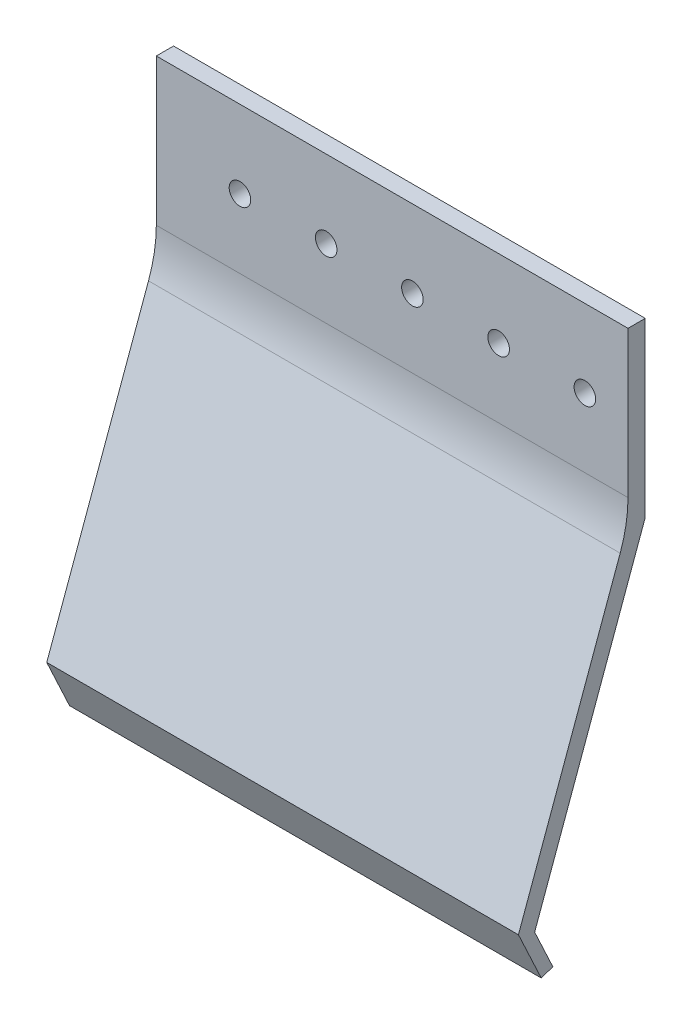
ISO-10303-21;
HEADER;
FILE_DESCRIPTION(('STEP AP214'),'2;1');
FILE_NAME('part.step','',(''),(''),'','','');
FILE_SCHEMA(('AUTOMOTIVE_DESIGN { 1 0 10303 214 1 1 1 1 }'));
ENDSEC;
DATA;
#1=APPLICATION_CONTEXT('core data for automotive mechanical design processes');
#2=APPLICATION_PROTOCOL_DEFINITION('international standard','automotive_design',2000,#1);
#3=PRODUCT_CONTEXT('',#1,'mechanical');
#4=PRODUCT('Part','Part','',(#3));
#5=PRODUCT_RELATED_PRODUCT_CATEGORY('part','',(#4));
#6=PRODUCT_DEFINITION_FORMATION('','',#4);
#7=PRODUCT_DEFINITION_CONTEXT('part definition',#1,'design');
#8=PRODUCT_DEFINITION('design','',#6,#7);
#9=PRODUCT_DEFINITION_SHAPE('','',#8);
#10=(LENGTH_UNIT() NAMED_UNIT(*) SI_UNIT(.MILLI.,.METRE.));
#11=(NAMED_UNIT(*) PLANE_ANGLE_UNIT() SI_UNIT($,.RADIAN.));
#12=(NAMED_UNIT(*) SI_UNIT($,.STERADIAN.) SOLID_ANGLE_UNIT());
#13=UNCERTAINTY_MEASURE_WITH_UNIT(LENGTH_MEASURE(1.E-05),#10,'distance_accuracy_value','');
#14=(GEOMETRIC_REPRESENTATION_CONTEXT(3) GLOBAL_UNCERTAINTY_ASSIGNED_CONTEXT((#13)) GLOBAL_UNIT_ASSIGNED_CONTEXT((#10,
#11,#12)) REPRESENTATION_CONTEXT('',''));
#15=CARTESIAN_POINT('',(0.,0.,0.));
#16=DIRECTION('',(0.,0.,1.));
#17=DIRECTION('',(1.,0.,0.));
#18=AXIS2_PLACEMENT_3D('',#15,#16,#17);
#19=CARTESIAN_POINT('',(-72.2,0.,8.));
#20=DIRECTION('',(1.,0.,0.));
#21=DIRECTION('',(0.,0.,-1.));
#22=AXIS2_PLACEMENT_3D('',#19,#20,#21);
#23=PLANE('',#22);
#24=DIRECTION('',(0.,0.,-1.));
#25=VECTOR('',#24,1.);
#26=CARTESIAN_POINT('',(-72.2,112.2,0.));
#27=LINE('',#26,#25);
#28=CARTESIAN_POINT('',(-72.2,112.2,12.));
#29=VERTEX_POINT('',#28);
#30=CARTESIAN_POINT('',(-72.2,112.2,8.));
#31=VERTEX_POINT('',#30);
#32=EDGE_CURVE('E11',#29,#31,#27,.T.);
#33=ORIENTED_EDGE('',*,*,#32,.T.);
#34=DIRECTION('',(0.,-1.,0.));
#35=VECTOR('',#34,1.);
#36=CARTESIAN_POINT('',(-72.2,0.,8.));
#37=LINE('',#36,#35);
#38=CARTESIAN_POINT('',(-72.2,72.2,8.));
#39=VERTEX_POINT('',#38);
#40=EDGE_CURVE('E113',#31,#39,#37,.T.);
#41=ORIENTED_EDGE('',*,*,#40,.T.);
#42=DIRECTION('',(0.,-0.939692620785906,0.342020143325676));
#43=VECTOR('',#42,1.);
#44=CARTESIAN_POINT('',(-72.2,72.2,8.));
#45=LINE('',#44,#43);
#46=CARTESIAN_POINT('',(-72.2,1.72305344105708,33.6515107494257));
#47=VERTEX_POINT('',#46);
#48=EDGE_CURVE('E191',#39,#47,#45,.T.);
#49=ORIENTED_EDGE('',*,*,#48,.T.);
#50=DIRECTION('',(0.,-0.906307787036651,-0.422618261740697));
#51=VECTOR('',#50,1.);
#52=CARTESIAN_POINT('',(-72.2,1.72305344105708,33.6515107494257));
#53=LINE('',#52,#51);
#54=CARTESIAN_POINT('',(-72.2,-7.34002442930944,29.4253281320187));
#55=VERTEX_POINT('',#54);
#56=EDGE_CURVE('E192',#47,#55,#53,.T.);
#57=ORIENTED_EDGE('',*,*,#56,.T.);
#58=DIRECTION('',(0.,-0.315262717408907,0.949004435717743));
#59=VECTOR('',#58,1.);
#60=CARTESIAN_POINT('',(-72.2,-8.23771332359837,32.1275529608106));
#61=LINE('',#60,#59);
#62=CARTESIAN_POINT('',(-72.2,-8.23771332359837,32.1275529608106));
#63=VERTEX_POINT('',#62);
#64=EDGE_CURVE('E195',#55,#63,#61,.T.);
#65=ORIENTED_EDGE('',*,*,#64,.T.);
#66=DIRECTION('',(0.,0.906307787036651,0.422618261740697));
#67=VECTOR('',#66,1.);
#68=CARTESIAN_POINT('',(-72.2,3.09113401435978,37.4102812325693));
#69=LINE('',#68,#67);
#70=CARTESIAN_POINT('',(-72.2,3.09113401435979,37.4102812325693));
#71=VERTEX_POINT('',#70);
#72=EDGE_CURVE('E220',#63,#71,#69,.T.);
#73=ORIENTED_EDGE('',*,*,#72,.T.);
#74=DIRECTION('',(0.,0.939692620785906,-0.342020143325676));
#75=VECTOR('',#74,1.);
#76=CARTESIAN_POINT('',(-72.2,72.9053079228339,12.));
#77=LINE('',#76,#75);
#78=CARTESIAN_POINT('',(-72.2,67.9345130443177,13.8092213764228));
#79=VERTEX_POINT('',#78);
#80=EDGE_CURVE('E175',#71,#79,#77,.T.);
#81=ORIENTED_EDGE('',*,*,#80,.T.);
#82=CARTESIAN_POINT('',(-72.2,78.195117344088,42.));
#83=DIRECTION('',(1.,0.,0.));
#84=DIRECTION('',(0.,0.,-1.));
#85=AXIS2_PLACEMENT_3D('',#82,#83,#84);
#86=CIRCLE('',#85,30.);
#87=CARTESIAN_POINT('',(-72.2,78.195117344088,12.));
#88=VERTEX_POINT('',#87);
#89=EDGE_CURVE('E128',#79,#88,#86,.T.);
#90=ORIENTED_EDGE('',*,*,#89,.T.);
#91=DIRECTION('',(0.,1.,0.));
#92=VECTOR('',#91,1.);
#93=CARTESIAN_POINT('',(-72.2,72.9053079228339,12.));
#94=LINE('',#93,#92);
#95=EDGE_CURVE('E170',#88,#29,#94,.T.);
#96=ORIENTED_EDGE('',*,*,#95,.T.);
#97=EDGE_LOOP('',(#33,#41,#49,#57,#65,#73,#81,#90,#96));
#98=FACE_BOUND('',#97,.T.);
#99=ADVANCED_FACE('F35',(#98),#23,.F.);
#100=CARTESIAN_POINT('',(37.2,0.,8.));
#101=DIRECTION('',(1.,0.,0.));
#102=DIRECTION('',(0.,0.,-1.));
#103=AXIS2_PLACEMENT_3D('',#100,#101,#102);
#104=PLANE('',#103);
#105=DIRECTION('',(0.,-1.,0.));
#106=VECTOR('',#105,1.);
#107=CARTESIAN_POINT('',(37.2,72.2,8.));
#108=LINE('',#107,#106);
#109=CARTESIAN_POINT('',(37.2,112.2,8.));
#110=VERTEX_POINT('',#109);
#111=CARTESIAN_POINT('',(37.2,72.2,8.));
#112=VERTEX_POINT('',#111);
#113=EDGE_CURVE('E110',#110,#112,#108,.T.);
#114=ORIENTED_EDGE('',*,*,#113,.F.);
#115=DIRECTION('',(0.,0.,1.));
#116=VECTOR('',#115,1.);
#117=CARTESIAN_POINT('',(37.2,112.2,0.));
#118=LINE('',#117,#116);
#119=CARTESIAN_POINT('',(37.2,112.2,12.));
#120=VERTEX_POINT('',#119);
#121=EDGE_CURVE('E43',#110,#120,#118,.T.);
#122=ORIENTED_EDGE('',*,*,#121,.T.);
#123=DIRECTION('',(0.,-1.,0.));
#124=VECTOR('',#123,1.);
#125=CARTESIAN_POINT('',(37.2,72.9053079228339,12.));
#126=LINE('',#125,#124);
#127=CARTESIAN_POINT('',(37.2,78.195117344088,12.));
#128=VERTEX_POINT('',#127);
#129=EDGE_CURVE('E179',#120,#128,#126,.T.);
#130=ORIENTED_EDGE('',*,*,#129,.T.);
#131=CARTESIAN_POINT('',(37.2,78.195117344088,42.));
#132=DIRECTION('',(-1.,0.,0.));
#133=DIRECTION('',(0.,0.,1.));
#134=AXIS2_PLACEMENT_3D('',#131,#132,#133);
#135=CIRCLE('',#134,30.);
#136=CARTESIAN_POINT('',(37.2,67.9345130443177,13.8092213764228));
#137=VERTEX_POINT('',#136);
#138=EDGE_CURVE('E51',#128,#137,#135,.T.);
#139=ORIENTED_EDGE('',*,*,#138,.T.);
#140=DIRECTION('',(0.,-0.939692620785906,0.342020143325676));
#141=VECTOR('',#140,1.);
#142=CARTESIAN_POINT('',(37.2,72.9053079228339,12.));
#143=LINE('',#142,#141);
#144=CARTESIAN_POINT('',(37.2,3.09113401435978,37.4102812325693));
#145=VERTEX_POINT('',#144);
#146=EDGE_CURVE('E200',#137,#145,#143,.T.);
#147=ORIENTED_EDGE('',*,*,#146,.T.);
#148=DIRECTION('',(0.,-0.906307787036651,-0.422618261740697));
#149=VECTOR('',#148,1.);
#150=CARTESIAN_POINT('',(37.2,3.09113401435978,37.4102812325693));
#151=LINE('',#150,#149);
#152=CARTESIAN_POINT('',(37.2,-8.23771332359837,32.1275529608106));
#153=VERTEX_POINT('',#152);
#154=EDGE_CURVE('E202',#145,#153,#151,.T.);
#155=ORIENTED_EDGE('',*,*,#154,.T.);
#156=DIRECTION('',(0.,0.315262717408907,-0.949004435717743));
#157=VECTOR('',#156,1.);
#158=CARTESIAN_POINT('',(37.2,-8.23771332359837,32.1275529608106));
#159=LINE('',#158,#157);
#160=CARTESIAN_POINT('',(37.2,-7.34002442930944,29.4253281320187));
#161=VERTEX_POINT('',#160);
#162=EDGE_CURVE('E205',#153,#161,#159,.T.);
#163=ORIENTED_EDGE('',*,*,#162,.T.);
#164=DIRECTION('',(0.,0.906307787036651,0.422618261740697));
#165=VECTOR('',#164,1.);
#166=CARTESIAN_POINT('',(37.2,1.72305344105708,33.6515107494257));
#167=LINE('',#166,#165);
#168=CARTESIAN_POINT('',(37.2,1.72305344105708,33.6515107494257));
#169=VERTEX_POINT('',#168);
#170=EDGE_CURVE('E185',#161,#169,#167,.T.);
#171=ORIENTED_EDGE('',*,*,#170,.T.);
#172=DIRECTION('',(0.,0.939692620785906,-0.342020143325676));
#173=VECTOR('',#172,1.);
#174=CARTESIAN_POINT('',(37.2,72.2,8.));
#175=LINE('',#174,#173);
#176=EDGE_CURVE('E122',#169,#112,#175,.T.);
#177=ORIENTED_EDGE('',*,*,#176,.T.);
#178=EDGE_LOOP('',(#114,#122,#130,#139,#147,#155,#163,#171,#177));
#179=FACE_BOUND('',#178,.T.);
#180=ADVANCED_FACE('F118',(#179),#104,.T.);
#181=CARTESIAN_POINT('',(-221.814036774629,112.2,0.));
#182=DIRECTION('',(0.,1.,0.));
#183=DIRECTION('',(0.,0.,1.));
#184=AXIS2_PLACEMENT_3D('',#181,#182,#183);
#185=PLANE('',#184);
#186=DIRECTION('',(1.,0.,0.));
#187=VECTOR('',#186,1.);
#188=CARTESIAN_POINT('',(-97.8,112.2,8.));
#189=LINE('',#188,#187);
#190=EDGE_CURVE('E107',#31,#110,#189,.T.);
#191=ORIENTED_EDGE('',*,*,#190,.F.);
#192=ORIENTED_EDGE('',*,*,#32,.F.);
#193=DIRECTION('',(1.,0.,0.));
#194=VECTOR('',#193,1.);
#195=CARTESIAN_POINT('',(-196.176640673943,112.2,12.));
#196=LINE('',#195,#194);
#197=EDGE_CURVE('E126',#29,#120,#196,.T.);
#198=ORIENTED_EDGE('',*,*,#197,.T.);
#199=ORIENTED_EDGE('',*,*,#121,.F.);
#200=EDGE_LOOP('',(#191,#192,#198,#199));
#201=FACE_BOUND('',#200,.T.);
#202=ADVANCED_FACE('F124',(#201),#185,.T.);
#203=CARTESIAN_POINT('',(-196.176640673943,72.2,8.));
#204=DIRECTION('',(0.,-0.342020143325676,-0.939692620785906));
#205=DIRECTION('',(0.,0.939692620785906,-0.342020143325676));
#206=AXIS2_PLACEMENT_3D('',#203,#204,#205);
#207=PLANE('',#206);
#208=ORIENTED_EDGE('',*,*,#48,.F.);
#209=DIRECTION('',(1.,0.,0.));
#210=VECTOR('',#209,1.);
#211=CARTESIAN_POINT('',(-196.176640673943,72.2,8.));
#212=LINE('',#211,#210);
#213=EDGE_CURVE('E176',#39,#112,#212,.T.);
#214=ORIENTED_EDGE('',*,*,#213,.T.);
#215=ORIENTED_EDGE('',*,*,#176,.F.);
#216=DIRECTION('',(1.,0.,0.));
#217=VECTOR('',#216,1.);
#218=CARTESIAN_POINT('',(-196.176640673943,1.72305344105708,33.6515107494257));
#219=LINE('',#218,#217);
#220=EDGE_CURVE('E210',#47,#169,#219,.T.);
#221=ORIENTED_EDGE('',*,*,#220,.F.);
#222=EDGE_LOOP('',(#208,#214,#215,#221));
#223=FACE_BOUND('',#222,.T.);
#224=ADVANCED_FACE('F234',(#223),#207,.T.);
#225=CARTESIAN_POINT('',(-196.176640673943,1.72305344105708,33.6515107494257));
#226=DIRECTION('',(0.,0.422618261740697,-0.906307787036651));
#227=DIRECTION('',(0.,0.906307787036651,0.422618261740697));
#228=AXIS2_PLACEMENT_3D('',#225,#226,#227);
#229=PLANE('',#228);
#230=ORIENTED_EDGE('',*,*,#56,.F.);
#231=ORIENTED_EDGE('',*,*,#220,.T.);
#232=ORIENTED_EDGE('',*,*,#170,.F.);
#233=DIRECTION('',(1.,0.,0.));
#234=VECTOR('',#233,1.);
#235=CARTESIAN_POINT('',(-196.176640673943,-7.34002442930944,29.4253281320187));
#236=LINE('',#235,#234);
#237=EDGE_CURVE('E212',#55,#161,#236,.T.);
#238=ORIENTED_EDGE('',*,*,#237,.F.);
#239=EDGE_LOOP('',(#230,#231,#232,#238));
#240=FACE_BOUND('',#239,.T.);
#241=ADVANCED_FACE('F231',(#240),#229,.T.);
#242=CARTESIAN_POINT('',(-196.176640673943,-8.23771332359837,32.1275529608106));
#243=DIRECTION('',(0.,-0.949004435717743,-0.315262717408907));
#244=DIRECTION('',(0.,0.315262717408907,-0.949004435717743));
#245=AXIS2_PLACEMENT_3D('',#242,#243,#244);
#246=PLANE('',#245);
#247=ORIENTED_EDGE('',*,*,#64,.F.);
#248=ORIENTED_EDGE('',*,*,#237,.T.);
#249=ORIENTED_EDGE('',*,*,#162,.F.);
#250=DIRECTION('',(1.,0.,0.));
#251=VECTOR('',#250,1.);
#252=CARTESIAN_POINT('',(-196.176640673943,-8.23771332359837,32.1275529608106));
#253=LINE('',#252,#251);
#254=EDGE_CURVE('E183',#63,#153,#253,.T.);
#255=ORIENTED_EDGE('',*,*,#254,.F.);
#256=EDGE_LOOP('',(#247,#248,#249,#255));
#257=FACE_BOUND('',#256,.T.);
#258=ADVANCED_FACE('F223',(#257),#246,.T.);
#259=CARTESIAN_POINT('',(-196.176640673943,3.09113401435978,37.4102812325693));
#260=DIRECTION('',(0.,-0.422618261740697,0.906307787036651));
#261=DIRECTION('',(0.,-0.906307787036651,-0.422618261740697));
#262=AXIS2_PLACEMENT_3D('',#259,#260,#261);
#263=PLANE('',#262);
#264=ORIENTED_EDGE('',*,*,#72,.F.);
#265=ORIENTED_EDGE('',*,*,#254,.T.);
#266=ORIENTED_EDGE('',*,*,#154,.F.);
#267=DIRECTION('',(1.,0.,0.));
#268=VECTOR('',#267,1.);
#269=CARTESIAN_POINT('',(-196.176640673943,3.09113401435978,37.4102812325693));
#270=LINE('',#269,#268);
#271=EDGE_CURVE('E180',#71,#145,#270,.T.);
#272=ORIENTED_EDGE('',*,*,#271,.F.);
#273=EDGE_LOOP('',(#264,#265,#266,#272));
#274=FACE_BOUND('',#273,.T.);
#275=ADVANCED_FACE('F218',(#274),#263,.T.);
#276=CARTESIAN_POINT('',(-196.176640673943,72.9053079228339,12.));
#277=DIRECTION('',(0.,0.342020143325676,0.939692620785906));
#278=DIRECTION('',(0.,-0.939692620785906,0.342020143325676));
#279=AXIS2_PLACEMENT_3D('',#276,#277,#278);
#280=PLANE('',#279);
#281=ORIENTED_EDGE('',*,*,#146,.F.);
#282=DIRECTION('',(1.,0.,0.));
#283=VECTOR('',#282,1.);
#284=CARTESIAN_POINT('',(-72.2,67.9345130443177,13.8092213764228));
#285=LINE('',#284,#283);
#286=EDGE_CURVE('E58',#137,#79,#285,.F.);
#287=ORIENTED_EDGE('',*,*,#286,.T.);
#288=ORIENTED_EDGE('',*,*,#80,.F.);
#289=ORIENTED_EDGE('',*,*,#271,.T.);
#290=EDGE_LOOP('',(#281,#287,#288,#289));
#291=FACE_BOUND('',#290,.T.);
#292=ADVANCED_FACE('F226',(#291),#280,.T.);
#293=CARTESIAN_POINT('',(-196.176640673943,72.9053079228339,12.));
#294=DIRECTION('',(0.,0.,1.));
#295=DIRECTION('',(1.,0.,0.));
#296=AXIS2_PLACEMENT_3D('',#293,#294,#295);
#297=PLANE('',#296);
#298=CARTESIAN_POINT('',(-52.8,94.2,12.));
#299=DIRECTION('',(0.,0.,1.));
#300=DIRECTION('',(-1.,0.,0.));
#301=AXIS2_PLACEMENT_3D('',#298,#299,#300);
#302=CIRCLE('',#301,2.5);
#303=CARTESIAN_POINT('',(-55.3,94.2,12.));
#304=VERTEX_POINT('',#303);
#305=EDGE_CURVE('E137',#304,#304,#302,.T.);
#306=ORIENTED_EDGE('',*,*,#305,.F.);
#307=EDGE_LOOP('',(#306));
#308=FACE_BOUND('',#307,.T.);
#309=CARTESIAN_POINT('',(-32.8,94.2,12.));
#310=DIRECTION('',(0.,0.,1.));
#311=DIRECTION('',(-1.,0.,0.));
#312=AXIS2_PLACEMENT_3D('',#309,#310,#311);
#313=CIRCLE('',#312,2.5);
#314=CARTESIAN_POINT('',(-35.3,94.2,12.));
#315=VERTEX_POINT('',#314);
#316=EDGE_CURVE('E291',#315,#315,#313,.T.);
#317=ORIENTED_EDGE('',*,*,#316,.F.);
#318=EDGE_LOOP('',(#317));
#319=FACE_BOUND('',#318,.T.);
#320=CARTESIAN_POINT('',(-12.8,94.2,12.));
#321=DIRECTION('',(0.,0.,1.));
#322=DIRECTION('',(-1.,0.,0.));
#323=AXIS2_PLACEMENT_3D('',#320,#321,#322);
#324=CIRCLE('',#323,2.5);
#325=CARTESIAN_POINT('',(-15.3,94.2,12.));
#326=VERTEX_POINT('',#325);
#327=EDGE_CURVE('E282',#326,#326,#324,.T.);
#328=ORIENTED_EDGE('',*,*,#327,.F.);
#329=EDGE_LOOP('',(#328));
#330=FACE_BOUND('',#329,.T.);
#331=CARTESIAN_POINT('',(7.2,94.2,12.));
#332=DIRECTION('',(0.,0.,1.));
#333=DIRECTION('',(-1.,0.,0.));
#334=AXIS2_PLACEMENT_3D('',#331,#332,#333);
#335=CIRCLE('',#334,2.50000000000001);
#336=CARTESIAN_POINT('',(4.69999999999999,94.2,12.));
#337=VERTEX_POINT('',#336);
#338=EDGE_CURVE('E292',#337,#337,#335,.T.);
#339=ORIENTED_EDGE('',*,*,#338,.F.);
#340=EDGE_LOOP('',(#339));
#341=FACE_BOUND('',#340,.T.);
#342=CARTESIAN_POINT('',(27.2,94.2,12.));
#343=DIRECTION('',(0.,0.,1.));
#344=DIRECTION('',(-1.,0.,0.));
#345=AXIS2_PLACEMENT_3D('',#342,#343,#344);
#346=CIRCLE('',#345,2.5);
#347=CARTESIAN_POINT('',(24.7,94.2,12.));
#348=VERTEX_POINT('',#347);
#349=EDGE_CURVE('E297',#348,#348,#346,.T.);
#350=ORIENTED_EDGE('',*,*,#349,.F.);
#351=EDGE_LOOP('',(#350));
#352=FACE_BOUND('',#351,.T.);
#353=ORIENTED_EDGE('',*,*,#95,.F.);
#354=DIRECTION('',(1.,0.,0.));
#355=VECTOR('',#354,1.);
#356=CARTESIAN_POINT('',(37.2,78.195117344088,12.));
#357=LINE('',#356,#355);
#358=EDGE_CURVE('E189',#88,#128,#357,.T.);
#359=ORIENTED_EDGE('',*,*,#358,.T.);
#360=ORIENTED_EDGE('',*,*,#129,.F.);
#361=ORIENTED_EDGE('',*,*,#197,.F.);
#362=EDGE_LOOP('',(#353,#359,#360,#361));
#363=FACE_BOUND('',#362,.T.);
#364=ADVANCED_FACE('F178',(#308,#319,#330,#341,#352,#363),#297,.T.);
#365=CARTESIAN_POINT('',(-196.176640673943,78.195117344088,42.));
#366=DIRECTION('',(-1.,0.,0.));
#367=DIRECTION('',(0.,0.,1.));
#368=AXIS2_PLACEMENT_3D('',#365,#366,#367);
#369=CYLINDRICAL_SURFACE('',#368,30.);
#370=ORIENTED_EDGE('',*,*,#89,.F.);
#371=ORIENTED_EDGE('',*,*,#286,.F.);
#372=ORIENTED_EDGE('',*,*,#138,.F.);
#373=ORIENTED_EDGE('',*,*,#358,.F.);
#374=EDGE_LOOP('',(#370,#371,#372,#373));
#375=FACE_BOUND('',#374,.T.);
#376=ADVANCED_FACE('F254',(#375),#369,.F.);
#377=CARTESIAN_POINT('',(-97.8,72.2,8.));
#378=DIRECTION('',(0.,0.,1.));
#379=DIRECTION('',(1.,0.,0.));
#380=AXIS2_PLACEMENT_3D('',#377,#378,#379);
#381=PLANE('',#380);
#382=CARTESIAN_POINT('',(-52.8,94.2,8.));
#383=DIRECTION('',(0.,0.,1.));
#384=DIRECTION('',(1.,0.,0.));
#385=AXIS2_PLACEMENT_3D('',#382,#383,#384);
#386=CIRCLE('',#385,2.5);
#387=CARTESIAN_POINT('',(-50.3,94.2,8.));
#388=VERTEX_POINT('',#387);
#389=EDGE_CURVE('E38',#388,#388,#386,.T.);
#390=ORIENTED_EDGE('',*,*,#389,.T.);
#391=EDGE_LOOP('',(#390));
#392=FACE_BOUND('',#391,.T.);
#393=CARTESIAN_POINT('',(-32.8,94.2,8.));
#394=DIRECTION('',(0.,0.,1.));
#395=DIRECTION('',(1.,0.,0.));
#396=AXIS2_PLACEMENT_3D('',#393,#394,#395);
#397=CIRCLE('',#396,2.5);
#398=CARTESIAN_POINT('',(-30.3,94.2,8.));
#399=VERTEX_POINT('',#398);
#400=EDGE_CURVE('E142',#399,#399,#397,.T.);
#401=ORIENTED_EDGE('',*,*,#400,.T.);
#402=EDGE_LOOP('',(#401));
#403=FACE_BOUND('',#402,.T.);
#404=CARTESIAN_POINT('',(-12.8,94.2,8.));
#405=DIRECTION('',(0.,0.,1.));
#406=DIRECTION('',(1.,0.,0.));
#407=AXIS2_PLACEMENT_3D('',#404,#405,#406);
#408=CIRCLE('',#407,2.5);
#409=CARTESIAN_POINT('',(-10.3,94.2,8.));
#410=VERTEX_POINT('',#409);
#411=EDGE_CURVE('E140',#410,#410,#408,.T.);
#412=ORIENTED_EDGE('',*,*,#411,.T.);
#413=EDGE_LOOP('',(#412));
#414=FACE_BOUND('',#413,.T.);
#415=CARTESIAN_POINT('',(7.2,94.2,8.));
#416=DIRECTION('',(0.,0.,1.));
#417=DIRECTION('',(1.,0.,0.));
#418=AXIS2_PLACEMENT_3D('',#415,#416,#417);
#419=CIRCLE('',#418,2.50000000000001);
#420=CARTESIAN_POINT('',(9.70000000000001,94.2,8.));
#421=VERTEX_POINT('',#420);
#422=EDGE_CURVE('E136',#421,#421,#419,.T.);
#423=ORIENTED_EDGE('',*,*,#422,.T.);
#424=EDGE_LOOP('',(#423));
#425=FACE_BOUND('',#424,.T.);
#426=CARTESIAN_POINT('',(27.2,94.2,8.));
#427=DIRECTION('',(0.,0.,1.));
#428=DIRECTION('',(1.,0.,0.));
#429=AXIS2_PLACEMENT_3D('',#426,#427,#428);
#430=CIRCLE('',#429,2.5);
#431=CARTESIAN_POINT('',(29.7,94.2,8.));
#432=VERTEX_POINT('',#431);
#433=EDGE_CURVE('E133',#432,#432,#430,.T.);
#434=ORIENTED_EDGE('',*,*,#433,.T.);
#435=EDGE_LOOP('',(#434));
#436=FACE_BOUND('',#435,.T.);
#437=ORIENTED_EDGE('',*,*,#190,.T.);
#438=ORIENTED_EDGE('',*,*,#113,.T.);
#439=ORIENTED_EDGE('',*,*,#213,.F.);
#440=ORIENTED_EDGE('',*,*,#40,.F.);
#441=EDGE_LOOP('',(#437,#438,#439,#440));
#442=FACE_BOUND('',#441,.T.);
#443=ADVANCED_FACE('F109',(#392,#403,#414,#425,#436,#442),#381,.F.);
#444=CARTESIAN_POINT('',(27.2,94.2,2.));
#445=DIRECTION('',(0.,0.,1.));
#446=DIRECTION('',(1.,0.,0.));
#447=AXIS2_PLACEMENT_3D('',#444,#445,#446);
#448=CYLINDRICAL_SURFACE('',#447,2.5);
#449=ORIENTED_EDGE('',*,*,#349,.T.);
#450=EDGE_LOOP('',(#449));
#451=FACE_BOUND('',#450,.T.);
#452=ORIENTED_EDGE('',*,*,#433,.F.);
#453=EDGE_LOOP('',(#452));
#454=FACE_BOUND('',#453,.T.);
#455=ADVANCED_FACE('F261',(#451,#454),#448,.F.);
#456=CARTESIAN_POINT('',(7.2,94.2,2.));
#457=DIRECTION('',(0.,0.,1.));
#458=DIRECTION('',(1.,0.,0.));
#459=AXIS2_PLACEMENT_3D('',#456,#457,#458);
#460=CYLINDRICAL_SURFACE('',#459,2.50000000000001);
#461=ORIENTED_EDGE('',*,*,#338,.T.);
#462=EDGE_LOOP('',(#461));
#463=FACE_BOUND('',#462,.T.);
#464=ORIENTED_EDGE('',*,*,#422,.F.);
#465=EDGE_LOOP('',(#464));
#466=FACE_BOUND('',#465,.T.);
#467=ADVANCED_FACE('F265',(#463,#466),#460,.F.);
#468=CARTESIAN_POINT('',(-12.8,94.2,2.));
#469=DIRECTION('',(0.,0.,1.));
#470=DIRECTION('',(1.,0.,0.));
#471=AXIS2_PLACEMENT_3D('',#468,#469,#470);
#472=CYLINDRICAL_SURFACE('',#471,2.5);
#473=ORIENTED_EDGE('',*,*,#327,.T.);
#474=EDGE_LOOP('',(#473));
#475=FACE_BOUND('',#474,.T.);
#476=ORIENTED_EDGE('',*,*,#411,.F.);
#477=EDGE_LOOP('',(#476));
#478=FACE_BOUND('',#477,.T.);
#479=ADVANCED_FACE('F158',(#475,#478),#472,.F.);
#480=CARTESIAN_POINT('',(-32.8,94.2,2.));
#481=DIRECTION('',(0.,0.,1.));
#482=DIRECTION('',(1.,0.,0.));
#483=AXIS2_PLACEMENT_3D('',#480,#481,#482);
#484=CYLINDRICAL_SURFACE('',#483,2.5);
#485=ORIENTED_EDGE('',*,*,#316,.T.);
#486=EDGE_LOOP('',(#485));
#487=FACE_BOUND('',#486,.T.);
#488=ORIENTED_EDGE('',*,*,#400,.F.);
#489=EDGE_LOOP('',(#488));
#490=FACE_BOUND('',#489,.T.);
#491=ADVANCED_FACE('F152',(#487,#490),#484,.F.);
#492=CARTESIAN_POINT('',(-52.8,94.2,2.));
#493=DIRECTION('',(0.,0.,1.));
#494=DIRECTION('',(1.,0.,0.));
#495=AXIS2_PLACEMENT_3D('',#492,#493,#494);
#496=CYLINDRICAL_SURFACE('',#495,2.5);
#497=ORIENTED_EDGE('',*,*,#305,.T.);
#498=EDGE_LOOP('',(#497));
#499=FACE_BOUND('',#498,.T.);
#500=ORIENTED_EDGE('',*,*,#389,.F.);
#501=EDGE_LOOP('',(#500));
#502=FACE_BOUND('',#501,.T.);
#503=ADVANCED_FACE('F150',(#499,#502),#496,.F.);
#504=CLOSED_SHELL('',(#99,#180,#202,#224,#241,#258,#275,#292,#364,#376,#443,#455,#467,#479,#491,#503));
#505=MANIFOLD_SOLID_BREP('B2',#504);
#506=ADVANCED_BREP_SHAPE_REPRESENTATION('',(#18,#505),#14);
#507=SHAPE_DEFINITION_REPRESENTATION(#9,#506);
ENDSEC;
END-ISO-10303-21;
